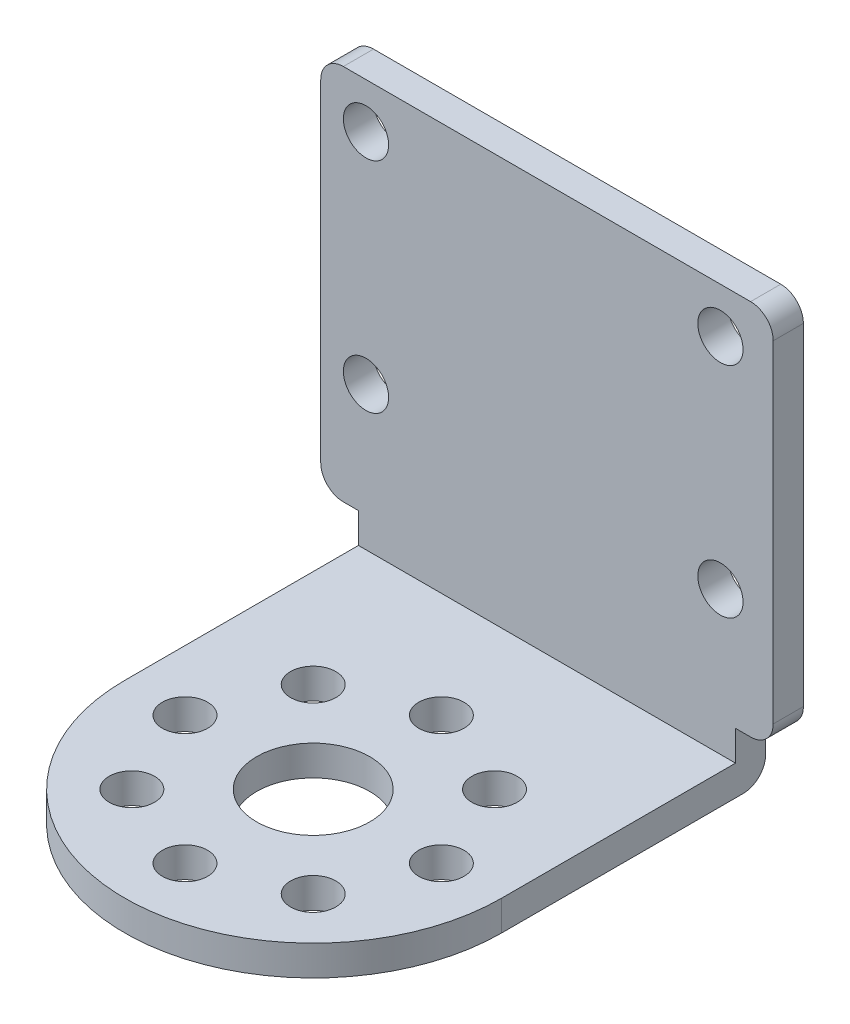
ISO-10303-21;
HEADER;
FILE_DESCRIPTION(('STEP AP214'),'2;1');
FILE_NAME('part.step','',(''),(''),'','','');
FILE_SCHEMA(('AUTOMOTIVE_DESIGN { 1 0 10303 214 1 1 1 1 }'));
ENDSEC;
DATA;
#1=APPLICATION_CONTEXT('core data for automotive mechanical design processes');
#2=APPLICATION_PROTOCOL_DEFINITION('international standard','automotive_design',2000,#1);
#3=PRODUCT_CONTEXT('',#1,'mechanical');
#4=PRODUCT('Part','Part','',(#3));
#5=PRODUCT_RELATED_PRODUCT_CATEGORY('part','',(#4));
#6=PRODUCT_DEFINITION_FORMATION('','',#4);
#7=PRODUCT_DEFINITION_CONTEXT('part definition',#1,'design');
#8=PRODUCT_DEFINITION('design','',#6,#7);
#9=PRODUCT_DEFINITION_SHAPE('','',#8);
#10=(LENGTH_UNIT() NAMED_UNIT(*) SI_UNIT(.MILLI.,.METRE.));
#11=(NAMED_UNIT(*) PLANE_ANGLE_UNIT() SI_UNIT($,.RADIAN.));
#12=(NAMED_UNIT(*) SI_UNIT($,.STERADIAN.) SOLID_ANGLE_UNIT());
#13=UNCERTAINTY_MEASURE_WITH_UNIT(LENGTH_MEASURE(1.E-05),#10,'distance_accuracy_value','');
#14=(GEOMETRIC_REPRESENTATION_CONTEXT(3) GLOBAL_UNCERTAINTY_ASSIGNED_CONTEXT((#13)) GLOBAL_UNIT_ASSIGNED_CONTEXT((#10,
#11,#12)) REPRESENTATION_CONTEXT('',''));
#15=CARTESIAN_POINT('',(0.,0.,0.));
#16=DIRECTION('',(0.,0.,1.));
#17=DIRECTION('',(1.,0.,0.));
#18=AXIS2_PLACEMENT_3D('',#15,#16,#17);
#19=CARTESIAN_POINT('',(0.,14.5,2.));
#20=DIRECTION('',(0.,0.,1.));
#21=DIRECTION('',(1.,0.,0.));
#22=AXIS2_PLACEMENT_3D('',#19,#20,#21);
#23=PLANE('',#22);
#24=CARTESIAN_POINT('',(11.5,11.5,2.));
#25=DIRECTION('',(0.,0.,-1.));
#26=DIRECTION('',(1.,0.,0.));
#27=AXIS2_PLACEMENT_3D('',#24,#25,#26);
#28=CIRCLE('',#27,1.5);
#29=CARTESIAN_POINT('',(10.,11.5,2.));
#30=VERTEX_POINT('',#29);
#31=EDGE_CURVE('E254',#30,#30,#28,.T.);
#32=ORIENTED_EDGE('',*,*,#31,.T.);
#33=EDGE_LOOP('',(#32));
#34=FACE_BOUND('',#33,.T.);
#35=CARTESIAN_POINT('',(11.5,26.,2.));
#36=DIRECTION('',(0.,0.,-1.));
#37=DIRECTION('',(1.,0.,0.));
#38=AXIS2_PLACEMENT_3D('',#35,#36,#37);
#39=CIRCLE('',#38,1.5);
#40=CARTESIAN_POINT('',(10.,26.,2.));
#41=VERTEX_POINT('',#40);
#42=EDGE_CURVE('E214',#41,#41,#39,.T.);
#43=ORIENTED_EDGE('',*,*,#42,.T.);
#44=EDGE_LOOP('',(#43));
#45=FACE_BOUND('',#44,.T.);
#46=CARTESIAN_POINT('',(-12.,11.5,2.));
#47=DIRECTION('',(0.,0.,-1.));
#48=DIRECTION('',(1.,0.,0.));
#49=AXIS2_PLACEMENT_3D('',#46,#47,#48);
#50=CIRCLE('',#49,1.5);
#51=CARTESIAN_POINT('',(-13.5,11.5,2.));
#52=VERTEX_POINT('',#51);
#53=EDGE_CURVE('E213',#52,#52,#50,.T.);
#54=ORIENTED_EDGE('',*,*,#53,.T.);
#55=EDGE_LOOP('',(#54));
#56=FACE_BOUND('',#55,.T.);
#57=CARTESIAN_POINT('',(-12.,26.,2.));
#58=DIRECTION('',(0.,0.,-1.));
#59=DIRECTION('',(1.,0.,0.));
#60=AXIS2_PLACEMENT_3D('',#57,#58,#59);
#61=CIRCLE('',#60,1.5);
#62=CARTESIAN_POINT('',(-13.5,26.,2.));
#63=VERTEX_POINT('',#62);
#64=EDGE_CURVE('E299',#63,#63,#61,.T.);
#65=ORIENTED_EDGE('',*,*,#64,.T.);
#66=EDGE_LOOP('',(#65));
#67=FACE_BOUND('',#66,.T.);
#68=CARTESIAN_POINT('',(13.5,27.5,2.));
#69=DIRECTION('',(0.,0.,-1.));
#70=DIRECTION('',(0.707106781186548,0.707106781186547,0.));
#71=AXIS2_PLACEMENT_3D('',#68,#69,#70);
#72=CIRCLE('',#71,1.5);
#73=CARTESIAN_POINT('',(13.5,29.,2.));
#74=VERTEX_POINT('',#73);
#75=CARTESIAN_POINT('',(15.,27.5,2.));
#76=VERTEX_POINT('',#75);
#77=EDGE_CURVE('E367',#74,#76,#72,.T.);
#78=ORIENTED_EDGE('',*,*,#77,.F.);
#79=DIRECTION('',(-1.,0.,0.));
#80=VECTOR('',#79,1.);
#81=CARTESIAN_POINT('',(-15.,29.,2.));
#82=LINE('',#81,#80);
#83=CARTESIAN_POINT('',(-13.5,29.,2.));
#84=VERTEX_POINT('',#83);
#85=EDGE_CURVE('E443',#74,#84,#82,.T.);
#86=ORIENTED_EDGE('',*,*,#85,.T.);
#87=CARTESIAN_POINT('',(-13.5,27.5,2.));
#88=DIRECTION('',(0.,0.,-1.));
#89=DIRECTION('',(-0.707106781186546,0.707106781186549,0.));
#90=AXIS2_PLACEMENT_3D('',#87,#88,#89);
#91=CIRCLE('',#90,1.5);
#92=CARTESIAN_POINT('',(-15.,27.5,2.));
#93=VERTEX_POINT('',#92);
#94=EDGE_CURVE('E339',#93,#84,#91,.T.);
#95=ORIENTED_EDGE('',*,*,#94,.F.);
#96=DIRECTION('',(0.,-1.,0.));
#97=VECTOR('',#96,1.);
#98=CARTESIAN_POINT('',(-15.,4.,2.));
#99=LINE('',#98,#97);
#100=CARTESIAN_POINT('',(-15.,5.5,2.));
#101=VERTEX_POINT('',#100);
#102=EDGE_CURVE('E26',#93,#101,#99,.T.);
#103=ORIENTED_EDGE('',*,*,#102,.T.);
#104=CARTESIAN_POINT('',(-13.5,5.5,2.));
#105=DIRECTION('',(0.,0.,-1.));
#106=DIRECTION('',(-0.707106781186547,-0.707106781186548,0.));
#107=AXIS2_PLACEMENT_3D('',#104,#105,#106);
#108=CIRCLE('',#107,1.5);
#109=CARTESIAN_POINT('',(-13.5,4.,2.));
#110=VERTEX_POINT('',#109);
#111=EDGE_CURVE('E183',#110,#101,#108,.T.);
#112=ORIENTED_EDGE('',*,*,#111,.F.);
#113=DIRECTION('',(1.,0.,0.));
#114=VECTOR('',#113,1.);
#115=CARTESIAN_POINT('',(-15.,4.,2.));
#116=LINE('',#115,#114);
#117=CARTESIAN_POINT('',(-12.5,4.,2.));
#118=VERTEX_POINT('',#117);
#119=EDGE_CURVE('E344',#110,#118,#116,.T.);
#120=ORIENTED_EDGE('',*,*,#119,.T.);
#121=DIRECTION('',(0.,-1.,0.));
#122=VECTOR('',#121,1.);
#123=CARTESIAN_POINT('',(-12.5,4.,2.));
#124=LINE('',#123,#122);
#125=CARTESIAN_POINT('',(-12.5,2.,2.));
#126=VERTEX_POINT('',#125);
#127=EDGE_CURVE('E338',#118,#126,#124,.T.);
#128=ORIENTED_EDGE('',*,*,#127,.T.);
#129=DIRECTION('',(1.,0.,0.));
#130=VECTOR('',#129,1.);
#131=CARTESIAN_POINT('',(6.25,2.,2.));
#132=LINE('',#131,#130);
#133=CARTESIAN_POINT('',(12.5,2.,2.));
#134=VERTEX_POINT('',#133);
#135=EDGE_CURVE('E308',#126,#134,#132,.T.);
#136=ORIENTED_EDGE('',*,*,#135,.T.);
#137=DIRECTION('',(0.,1.,0.));
#138=VECTOR('',#137,1.);
#139=CARTESIAN_POINT('',(12.5,4.,2.));
#140=LINE('',#139,#138);
#141=CARTESIAN_POINT('',(12.5,4.,2.));
#142=VERTEX_POINT('',#141);
#143=EDGE_CURVE('E193',#134,#142,#140,.T.);
#144=ORIENTED_EDGE('',*,*,#143,.T.);
#145=DIRECTION('',(1.,0.,0.));
#146=VECTOR('',#145,1.);
#147=CARTESIAN_POINT('',(15.,4.,2.));
#148=LINE('',#147,#146);
#149=CARTESIAN_POINT('',(13.5,4.,2.));
#150=VERTEX_POINT('',#149);
#151=EDGE_CURVE('E11',#142,#150,#148,.T.);
#152=ORIENTED_EDGE('',*,*,#151,.T.);
#153=CARTESIAN_POINT('',(13.5,5.5,2.));
#154=DIRECTION('',(0.,0.,-1.));
#155=DIRECTION('',(0.707106781186547,-0.707106781186548,0.));
#156=AXIS2_PLACEMENT_3D('',#153,#154,#155);
#157=CIRCLE('',#156,1.5);
#158=CARTESIAN_POINT('',(15.,5.5,2.));
#159=VERTEX_POINT('',#158);
#160=EDGE_CURVE('E382',#159,#150,#157,.T.);
#161=ORIENTED_EDGE('',*,*,#160,.F.);
#162=DIRECTION('',(0.,1.,0.));
#163=VECTOR('',#162,1.);
#164=CARTESIAN_POINT('',(15.,29.,2.));
#165=LINE('',#164,#163);
#166=EDGE_CURVE('E295',#159,#76,#165,.T.);
#167=ORIENTED_EDGE('',*,*,#166,.T.);
#168=EDGE_LOOP('',(#78,#86,#95,#103,#112,#120,#128,#136,#144,#152,#161,#167));
#169=FACE_BOUND('',#168,.T.);
#170=ADVANCED_FACE('F16',(#34,#45,#56,#67,#169),#23,.T.);
#171=CARTESIAN_POINT('',(12.5,4.,0.));
#172=DIRECTION('',(0.,-1.,0.));
#173=DIRECTION('',(0.,0.,-1.));
#174=AXIS2_PLACEMENT_3D('',#171,#172,#173);
#175=PLANE('',#174);
#176=DIRECTION('',(0.,0.,-1.));
#177=VECTOR('',#176,1.);
#178=CARTESIAN_POINT('',(13.5,4.,0.));
#179=LINE('',#178,#177);
#180=CARTESIAN_POINT('',(13.5,4.,0.));
#181=VERTEX_POINT('',#180);
#182=EDGE_CURVE('E378',#150,#181,#179,.T.);
#183=ORIENTED_EDGE('',*,*,#182,.F.);
#184=ORIENTED_EDGE('',*,*,#151,.F.);
#185=DIRECTION('',(0.,0.,1.));
#186=VECTOR('',#185,1.);
#187=CARTESIAN_POINT('',(12.5,4.,0.));
#188=LINE('',#187,#186);
#189=CARTESIAN_POINT('',(12.5,4.,0.));
#190=VERTEX_POINT('',#189);
#191=EDGE_CURVE('E318',#190,#142,#188,.T.);
#192=ORIENTED_EDGE('',*,*,#191,.F.);
#193=DIRECTION('',(-1.,0.,0.));
#194=VECTOR('',#193,1.);
#195=CARTESIAN_POINT('',(15.,4.,0.));
#196=LINE('',#195,#194);
#197=EDGE_CURVE('E242',#181,#190,#196,.T.);
#198=ORIENTED_EDGE('',*,*,#197,.F.);
#199=EDGE_LOOP('',(#183,#184,#192,#198));
#200=FACE_BOUND('',#199,.T.);
#201=ADVANCED_FACE('F706',(#200),#175,.T.);
#202=CARTESIAN_POINT('',(-15.,29.,0.));
#203=DIRECTION('',(-1.,0.,0.));
#204=DIRECTION('',(0.,0.,1.));
#205=AXIS2_PLACEMENT_3D('',#202,#203,#204);
#206=PLANE('',#205);
#207=DIRECTION('',(0.,0.,-1.));
#208=VECTOR('',#207,1.);
#209=CARTESIAN_POINT('',(-15.,5.5,0.));
#210=LINE('',#209,#208);
#211=CARTESIAN_POINT('',(-15.,5.5,0.));
#212=VERTEX_POINT('',#211);
#213=EDGE_CURVE('E258',#101,#212,#210,.T.);
#214=ORIENTED_EDGE('',*,*,#213,.F.);
#215=ORIENTED_EDGE('',*,*,#102,.F.);
#216=DIRECTION('',(0.,0.,1.));
#217=VECTOR('',#216,1.);
#218=CARTESIAN_POINT('',(-15.,27.5,0.));
#219=LINE('',#218,#217);
#220=CARTESIAN_POINT('',(-15.,27.5,0.));
#221=VERTEX_POINT('',#220);
#222=EDGE_CURVE('E450',#221,#93,#219,.T.);
#223=ORIENTED_EDGE('',*,*,#222,.F.);
#224=DIRECTION('',(0.,1.,0.));
#225=VECTOR('',#224,1.);
#226=CARTESIAN_POINT('',(-15.,4.,0.));
#227=LINE('',#226,#225);
#228=EDGE_CURVE('E304',#212,#221,#227,.T.);
#229=ORIENTED_EDGE('',*,*,#228,.F.);
#230=EDGE_LOOP('',(#214,#215,#223,#229));
#231=FACE_BOUND('',#230,.T.);
#232=ADVANCED_FACE('F526',(#231),#206,.T.);
#233=CARTESIAN_POINT('',(-12.,26.,0.));
#234=DIRECTION('',(0.,0.,1.));
#235=DIRECTION('',(1.,0.,0.));
#236=AXIS2_PLACEMENT_3D('',#233,#234,#235);
#237=CYLINDRICAL_SURFACE('',#236,1.5);
#238=ORIENTED_EDGE('',*,*,#64,.F.);
#239=DIRECTION('',(0.,0.,-1.));
#240=VECTOR('',#239,1.);
#241=CARTESIAN_POINT('',(-13.5,26.,0.));
#242=LINE('',#241,#240);
#243=CARTESIAN_POINT('',(-13.5,26.,0.));
#244=VERTEX_POINT('',#243);
#245=EDGE_CURVE('E39',#63,#244,#242,.T.);
#246=ORIENTED_EDGE('',*,*,#245,.T.);
#247=CARTESIAN_POINT('',(-12.,26.,0.));
#248=DIRECTION('',(0.,0.,-1.));
#249=DIRECTION('',(1.,0.,0.));
#250=AXIS2_PLACEMENT_3D('',#247,#248,#249);
#251=CIRCLE('',#250,1.5);
#252=EDGE_CURVE('E208',#244,#244,#251,.T.);
#253=ORIENTED_EDGE('',*,*,#252,.T.);
#254=ORIENTED_EDGE('',*,*,#245,.F.);
#255=EDGE_LOOP('',(#238,#246,#253,#254));
#256=FACE_BOUND('',#255,.T.);
#257=ADVANCED_FACE('F649',(#256),#237,.F.);
#258=CARTESIAN_POINT('',(-12.,11.5,0.));
#259=DIRECTION('',(0.,0.,1.));
#260=DIRECTION('',(1.,0.,0.));
#261=AXIS2_PLACEMENT_3D('',#258,#259,#260);
#262=CYLINDRICAL_SURFACE('',#261,1.5);
#263=ORIENTED_EDGE('',*,*,#53,.F.);
#264=DIRECTION('',(0.,0.,-1.));
#265=VECTOR('',#264,1.);
#266=CARTESIAN_POINT('',(-13.5,11.5,0.));
#267=LINE('',#266,#265);
#268=CARTESIAN_POINT('',(-13.5,11.5,0.));
#269=VERTEX_POINT('',#268);
#270=EDGE_CURVE('E296',#52,#269,#267,.T.);
#271=ORIENTED_EDGE('',*,*,#270,.T.);
#272=CARTESIAN_POINT('',(-12.,11.5,0.));
#273=DIRECTION('',(0.,0.,-1.));
#274=DIRECTION('',(1.,0.,0.));
#275=AXIS2_PLACEMENT_3D('',#272,#273,#274);
#276=CIRCLE('',#275,1.5);
#277=EDGE_CURVE('E204',#269,#269,#276,.T.);
#278=ORIENTED_EDGE('',*,*,#277,.T.);
#279=ORIENTED_EDGE('',*,*,#270,.F.);
#280=EDGE_LOOP('',(#263,#271,#278,#279));
#281=FACE_BOUND('',#280,.T.);
#282=ADVANCED_FACE('F654',(#281),#262,.F.);
#283=CARTESIAN_POINT('',(11.5,26.,0.));
#284=DIRECTION('',(0.,0.,1.));
#285=DIRECTION('',(1.,0.,0.));
#286=AXIS2_PLACEMENT_3D('',#283,#284,#285);
#287=CYLINDRICAL_SURFACE('',#286,1.5);
#288=ORIENTED_EDGE('',*,*,#42,.F.);
#289=DIRECTION('',(0.,0.,-1.));
#290=VECTOR('',#289,1.);
#291=CARTESIAN_POINT('',(10.,26.,0.));
#292=LINE('',#291,#290);
#293=CARTESIAN_POINT('',(10.,26.,0.));
#294=VERTEX_POINT('',#293);
#295=EDGE_CURVE('E210',#41,#294,#292,.T.);
#296=ORIENTED_EDGE('',*,*,#295,.T.);
#297=CARTESIAN_POINT('',(11.5,26.,0.));
#298=DIRECTION('',(0.,0.,-1.));
#299=DIRECTION('',(1.,0.,0.));
#300=AXIS2_PLACEMENT_3D('',#297,#298,#299);
#301=CIRCLE('',#300,1.5);
#302=EDGE_CURVE('E209',#294,#294,#301,.T.);
#303=ORIENTED_EDGE('',*,*,#302,.T.);
#304=ORIENTED_EDGE('',*,*,#295,.F.);
#305=EDGE_LOOP('',(#288,#296,#303,#304));
#306=FACE_BOUND('',#305,.T.);
#307=ADVANCED_FACE('F719',(#306),#287,.F.);
#308=CARTESIAN_POINT('',(11.5,11.5,0.));
#309=DIRECTION('',(0.,0.,1.));
#310=DIRECTION('',(1.,0.,0.));
#311=AXIS2_PLACEMENT_3D('',#308,#309,#310);
#312=CYLINDRICAL_SURFACE('',#311,1.5);
#313=ORIENTED_EDGE('',*,*,#31,.F.);
#314=DIRECTION('',(0.,0.,-1.));
#315=VECTOR('',#314,1.);
#316=CARTESIAN_POINT('',(10.,11.5,0.));
#317=LINE('',#316,#315);
#318=CARTESIAN_POINT('',(10.,11.5,0.));
#319=VERTEX_POINT('',#318);
#320=EDGE_CURVE('E233',#30,#319,#317,.T.);
#321=ORIENTED_EDGE('',*,*,#320,.T.);
#322=CARTESIAN_POINT('',(11.5,11.5,0.));
#323=DIRECTION('',(0.,0.,-1.));
#324=DIRECTION('',(1.,0.,0.));
#325=AXIS2_PLACEMENT_3D('',#322,#323,#324);
#326=CIRCLE('',#325,1.5);
#327=EDGE_CURVE('E218',#319,#319,#326,.T.);
#328=ORIENTED_EDGE('',*,*,#327,.T.);
#329=ORIENTED_EDGE('',*,*,#320,.F.);
#330=EDGE_LOOP('',(#313,#321,#328,#329));
#331=FACE_BOUND('',#330,.T.);
#332=ADVANCED_FACE('F425',(#331),#312,.F.);
#333=CARTESIAN_POINT('',(12.5,2.,2.));
#334=DIRECTION('',(0.,1.,0.));
#335=DIRECTION('',(1.,0.,0.));
#336=AXIS2_PLACEMENT_3D('',#333,#334,#335);
#337=PLANE('',#336);
#338=CARTESIAN_POINT('',(6.01040791404017,2.,23.5104079140402));
#339=DIRECTION('',(0.,-1.,0.));
#340=DIRECTION('',(1.,0.,0.));
#341=AXIS2_PLACEMENT_3D('',#338,#339,#340);
#342=CIRCLE('',#341,1.5);
#343=CARTESIAN_POINT('',(4.51040791404017,2.,23.5104079140402));
#344=VERTEX_POINT('',#343);
#345=EDGE_CURVE('E224',#344,#344,#342,.T.);
#346=ORIENTED_EDGE('',*,*,#345,.T.);
#347=EDGE_LOOP('',(#346));
#348=FACE_BOUND('',#347,.T.);
#349=CARTESIAN_POINT('',(-6.01040791404017,2.,11.4895920859598));
#350=DIRECTION('',(0.,-1.,0.));
#351=DIRECTION('',(1.,0.,0.));
#352=AXIS2_PLACEMENT_3D('',#349,#350,#351);
#353=CIRCLE('',#352,1.5);
#354=CARTESIAN_POINT('',(-7.51040791404017,2.,11.4895920859598));
#355=VERTEX_POINT('',#354);
#356=EDGE_CURVE('E348',#355,#355,#353,.T.);
#357=ORIENTED_EDGE('',*,*,#356,.T.);
#358=EDGE_LOOP('',(#357));
#359=FACE_BOUND('',#358,.T.);
#360=CARTESIAN_POINT('',(0.,2.,26.0000003874302));
#361=DIRECTION('',(0.,-1.,0.));
#362=DIRECTION('',(1.,0.,0.));
#363=AXIS2_PLACEMENT_3D('',#360,#361,#362);
#364=CIRCLE('',#363,1.5);
#365=CARTESIAN_POINT('',(-1.5,2.,26.0000003874302));
#366=VERTEX_POINT('',#365);
#367=EDGE_CURVE('E219',#366,#366,#364,.T.);
#368=ORIENTED_EDGE('',*,*,#367,.T.);
#369=EDGE_LOOP('',(#368));
#370=FACE_BOUND('',#369,.T.);
#371=CARTESIAN_POINT('',(0.,2.,17.5));
#372=DIRECTION('',(0.,-1.,0.));
#373=DIRECTION('',(1.,0.,0.));
#374=AXIS2_PLACEMENT_3D('',#371,#372,#373);
#375=CIRCLE('',#374,3.75);
#376=CARTESIAN_POINT('',(-3.75,2.,17.5));
#377=VERTEX_POINT('',#376);
#378=EDGE_CURVE('E261',#377,#377,#375,.T.);
#379=ORIENTED_EDGE('',*,*,#378,.T.);
#380=EDGE_LOOP('',(#379));
#381=FACE_BOUND('',#380,.T.);
#382=CARTESIAN_POINT('',(8.50000038743019,2.,17.5));
#383=DIRECTION('',(0.,-1.,0.));
#384=DIRECTION('',(1.,0.,0.));
#385=AXIS2_PLACEMENT_3D('',#382,#383,#384);
#386=CIRCLE('',#385,1.5);
#387=CARTESIAN_POINT('',(7.00000038743019,2.,17.5));
#388=VERTEX_POINT('',#387);
#389=EDGE_CURVE('E268',#388,#388,#386,.T.);
#390=ORIENTED_EDGE('',*,*,#389,.T.);
#391=EDGE_LOOP('',(#390));
#392=FACE_BOUND('',#391,.T.);
#393=CARTESIAN_POINT('',(0.,2.,8.99999961256981));
#394=DIRECTION('',(0.,-1.,0.));
#395=DIRECTION('',(1.,0.,0.));
#396=AXIS2_PLACEMENT_3D('',#393,#394,#395);
#397=CIRCLE('',#396,1.5);
#398=CARTESIAN_POINT('',(-1.5,2.,8.99999961256981));
#399=VERTEX_POINT('',#398);
#400=EDGE_CURVE('E199',#399,#399,#397,.T.);
#401=ORIENTED_EDGE('',*,*,#400,.T.);
#402=EDGE_LOOP('',(#401));
#403=FACE_BOUND('',#402,.T.);
#404=CARTESIAN_POINT('',(-6.01040791404017,2.,23.5104079140402));
#405=DIRECTION('',(0.,-1.,0.));
#406=DIRECTION('',(1.,0.,0.));
#407=AXIS2_PLACEMENT_3D('',#404,#405,#406);
#408=CIRCLE('',#407,1.5);
#409=CARTESIAN_POINT('',(-7.51040791404017,2.,23.5104079140402));
#410=VERTEX_POINT('',#409);
#411=EDGE_CURVE('E282',#410,#410,#408,.T.);
#412=ORIENTED_EDGE('',*,*,#411,.T.);
#413=EDGE_LOOP('',(#412));
#414=FACE_BOUND('',#413,.T.);
#415=CARTESIAN_POINT('',(-8.50000038743019,2.,17.5));
#416=DIRECTION('',(0.,-1.,0.));
#417=DIRECTION('',(1.,0.,0.));
#418=AXIS2_PLACEMENT_3D('',#415,#416,#417);
#419=CIRCLE('',#418,1.5);
#420=CARTESIAN_POINT('',(-10.0000003874302,2.,17.5));
#421=VERTEX_POINT('',#420);
#422=EDGE_CURVE('E331',#421,#421,#419,.T.);
#423=ORIENTED_EDGE('',*,*,#422,.T.);
#424=EDGE_LOOP('',(#423));
#425=FACE_BOUND('',#424,.T.);
#426=CARTESIAN_POINT('',(6.01040791404017,2.,11.4895920859598));
#427=DIRECTION('',(0.,-1.,0.));
#428=DIRECTION('',(1.,0.,0.));
#429=AXIS2_PLACEMENT_3D('',#426,#427,#428);
#430=CIRCLE('',#429,1.5);
#431=CARTESIAN_POINT('',(4.51040791404017,2.,11.4895920859598));
#432=VERTEX_POINT('',#431);
#433=EDGE_CURVE('E262',#432,#432,#430,.T.);
#434=ORIENTED_EDGE('',*,*,#433,.T.);
#435=EDGE_LOOP('',(#434));
#436=FACE_BOUND('',#435,.T.);
#437=CARTESIAN_POINT('',(0.,2.,17.5));
#438=DIRECTION('',(0.,1.,0.));
#439=DIRECTION('',(1.,0.,0.));
#440=AXIS2_PLACEMENT_3D('',#437,#438,#439);
#441=CIRCLE('',#440,12.5);
#442=CARTESIAN_POINT('',(-12.5,2.,17.5));
#443=VERTEX_POINT('',#442);
#444=CARTESIAN_POINT('',(12.5,2.,17.5));
#445=VERTEX_POINT('',#444);
#446=EDGE_CURVE('E154',#443,#445,#441,.T.);
#447=ORIENTED_EDGE('',*,*,#446,.T.);
#448=DIRECTION('',(0.,0.,1.));
#449=VECTOR('',#448,1.);
#450=CARTESIAN_POINT('',(12.5,2.,2.));
#451=LINE('',#450,#449);
#452=EDGE_CURVE('E187',#134,#445,#451,.T.);
#453=ORIENTED_EDGE('',*,*,#452,.F.);
#454=ORIENTED_EDGE('',*,*,#135,.F.);
#455=DIRECTION('',(0.,0.,1.));
#456=VECTOR('',#455,1.);
#457=CARTESIAN_POINT('',(-12.5,2.,2.));
#458=LINE('',#457,#456);
#459=EDGE_CURVE('E335',#126,#443,#458,.T.);
#460=ORIENTED_EDGE('',*,*,#459,.T.);
#461=EDGE_LOOP('',(#447,#453,#454,#460));
#462=FACE_BOUND('',#461,.T.);
#463=ADVANCED_FACE('F422',(#348,#359,#370,#381,#392,#403,#414,#425,#436,#462),#337,.T.);
#464=CARTESIAN_POINT('',(-12.5,0.,0.));
#465=DIRECTION('',(0.,-1.,0.));
#466=DIRECTION('',(0.,0.,-1.));
#467=AXIS2_PLACEMENT_3D('',#464,#465,#466);
#468=PLANE('',#467);
#469=CARTESIAN_POINT('',(6.01040791404017,0.,11.4895920859598));
#470=DIRECTION('',(0.,1.,0.));
#471=DIRECTION('',(1.,0.,0.));
#472=AXIS2_PLACEMENT_3D('',#469,#470,#471);
#473=CIRCLE('',#472,1.5);
#474=CARTESIAN_POINT('',(4.51040791404017,0.,11.4895920859598));
#475=VERTEX_POINT('',#474);
#476=EDGE_CURVE('E438',#475,#475,#473,.T.);
#477=ORIENTED_EDGE('',*,*,#476,.T.);
#478=EDGE_LOOP('',(#477));
#479=FACE_BOUND('',#478,.T.);
#480=CARTESIAN_POINT('',(-8.50000038743019,0.,17.5));
#481=DIRECTION('',(0.,1.,0.));
#482=DIRECTION('',(1.,0.,0.));
#483=AXIS2_PLACEMENT_3D('',#480,#481,#482);
#484=CIRCLE('',#483,1.5);
#485=CARTESIAN_POINT('',(-10.0000003874302,0.,17.5));
#486=VERTEX_POINT('',#485);
#487=EDGE_CURVE('E266',#486,#486,#484,.T.);
#488=ORIENTED_EDGE('',*,*,#487,.T.);
#489=EDGE_LOOP('',(#488));
#490=FACE_BOUND('',#489,.T.);
#491=CARTESIAN_POINT('',(-6.01040791404017,0.,23.5104079140402));
#492=DIRECTION('',(0.,1.,0.));
#493=DIRECTION('',(1.,0.,0.));
#494=AXIS2_PLACEMENT_3D('',#491,#492,#493);
#495=CIRCLE('',#494,1.5);
#496=CARTESIAN_POINT('',(-7.51040791404017,0.,23.5104079140402));
#497=VERTEX_POINT('',#496);
#498=EDGE_CURVE('E283',#497,#497,#495,.T.);
#499=ORIENTED_EDGE('',*,*,#498,.T.);
#500=EDGE_LOOP('',(#499));
#501=FACE_BOUND('',#500,.T.);
#502=CARTESIAN_POINT('',(0.,0.,8.99999961256981));
#503=DIRECTION('',(0.,1.,0.));
#504=DIRECTION('',(1.,0.,0.));
#505=AXIS2_PLACEMENT_3D('',#502,#503,#504);
#506=CIRCLE('',#505,1.5);
#507=CARTESIAN_POINT('',(-1.5,0.,8.99999961256981));
#508=VERTEX_POINT('',#507);
#509=EDGE_CURVE('E366',#508,#508,#506,.T.);
#510=ORIENTED_EDGE('',*,*,#509,.T.);
#511=EDGE_LOOP('',(#510));
#512=FACE_BOUND('',#511,.T.);
#513=CARTESIAN_POINT('',(8.50000038743019,0.,17.5));
#514=DIRECTION('',(0.,1.,0.));
#515=DIRECTION('',(1.,0.,0.));
#516=AXIS2_PLACEMENT_3D('',#513,#514,#515);
#517=CIRCLE('',#516,1.5);
#518=CARTESIAN_POINT('',(7.00000038743019,0.,17.5));
#519=VERTEX_POINT('',#518);
#520=EDGE_CURVE('E202',#519,#519,#517,.T.);
#521=ORIENTED_EDGE('',*,*,#520,.T.);
#522=EDGE_LOOP('',(#521));
#523=FACE_BOUND('',#522,.T.);
#524=CARTESIAN_POINT('',(0.,0.,17.5));
#525=DIRECTION('',(0.,1.,0.));
#526=DIRECTION('',(1.,0.,0.));
#527=AXIS2_PLACEMENT_3D('',#524,#525,#526);
#528=CIRCLE('',#527,3.75);
#529=CARTESIAN_POINT('',(-3.75,0.,17.5));
#530=VERTEX_POINT('',#529);
#531=EDGE_CURVE('E271',#530,#530,#528,.T.);
#532=ORIENTED_EDGE('',*,*,#531,.T.);
#533=EDGE_LOOP('',(#532));
#534=FACE_BOUND('',#533,.T.);
#535=CARTESIAN_POINT('',(0.,0.,26.0000003874302));
#536=DIRECTION('',(0.,1.,0.));
#537=DIRECTION('',(1.,0.,0.));
#538=AXIS2_PLACEMENT_3D('',#535,#536,#537);
#539=CIRCLE('',#538,1.5);
#540=CARTESIAN_POINT('',(-1.5,0.,26.0000003874302));
#541=VERTEX_POINT('',#540);
#542=EDGE_CURVE('E172',#541,#541,#539,.T.);
#543=ORIENTED_EDGE('',*,*,#542,.T.);
#544=EDGE_LOOP('',(#543));
#545=FACE_BOUND('',#544,.T.);
#546=CARTESIAN_POINT('',(-6.01040791404017,0.,11.4895920859598));
#547=DIRECTION('',(0.,1.,0.));
#548=DIRECTION('',(1.,0.,0.));
#549=AXIS2_PLACEMENT_3D('',#546,#547,#548);
#550=CIRCLE('',#549,1.5);
#551=CARTESIAN_POINT('',(-7.51040791404017,0.,11.4895920859598));
#552=VERTEX_POINT('',#551);
#553=EDGE_CURVE('E222',#552,#552,#550,.T.);
#554=ORIENTED_EDGE('',*,*,#553,.T.);
#555=EDGE_LOOP('',(#554));
#556=FACE_BOUND('',#555,.T.);
#557=CARTESIAN_POINT('',(6.01040791404017,0.,23.5104079140402));
#558=DIRECTION('',(0.,1.,0.));
#559=DIRECTION('',(1.,0.,0.));
#560=AXIS2_PLACEMENT_3D('',#557,#558,#559);
#561=CIRCLE('',#560,1.5);
#562=CARTESIAN_POINT('',(4.51040791404017,0.,23.5104079140402));
#563=VERTEX_POINT('',#562);
#564=EDGE_CURVE('E250',#563,#563,#561,.T.);
#565=ORIENTED_EDGE('',*,*,#564,.T.);
#566=EDGE_LOOP('',(#565));
#567=FACE_BOUND('',#566,.T.);
#568=DIRECTION('',(-1.,0.,0.));
#569=VECTOR('',#568,1.);
#570=CARTESIAN_POINT('',(-6.25,0.,1.5));
#571=LINE('',#570,#569);
#572=CARTESIAN_POINT('',(12.5,0.,1.5));
#573=VERTEX_POINT('',#572);
#574=CARTESIAN_POINT('',(-12.5,0.,1.5));
#575=VERTEX_POINT('',#574);
#576=EDGE_CURVE('E179',#573,#575,#571,.T.);
#577=ORIENTED_EDGE('',*,*,#576,.F.);
#578=DIRECTION('',(0.,0.,1.));
#579=VECTOR('',#578,1.);
#580=CARTESIAN_POINT('',(12.5,0.,0.));
#581=LINE('',#580,#579);
#582=CARTESIAN_POINT('',(12.5,0.,17.5));
#583=VERTEX_POINT('',#582);
#584=EDGE_CURVE('E176',#573,#583,#581,.T.);
#585=ORIENTED_EDGE('',*,*,#584,.T.);
#586=CARTESIAN_POINT('',(0.,0.,17.5));
#587=DIRECTION('',(0.,-1.,0.));
#588=DIRECTION('',(1.,0.,0.));
#589=AXIS2_PLACEMENT_3D('',#586,#587,#588);
#590=CIRCLE('',#589,12.5);
#591=CARTESIAN_POINT('',(-12.5,0.,17.5));
#592=VERTEX_POINT('',#591);
#593=EDGE_CURVE('E162',#583,#592,#590,.T.);
#594=ORIENTED_EDGE('',*,*,#593,.T.);
#595=DIRECTION('',(0.,0.,1.));
#596=VECTOR('',#595,1.);
#597=CARTESIAN_POINT('',(-12.5,0.,0.));
#598=LINE('',#597,#596);
#599=EDGE_CURVE('E227',#575,#592,#598,.T.);
#600=ORIENTED_EDGE('',*,*,#599,.F.);
#601=EDGE_LOOP('',(#577,#585,#594,#600));
#602=FACE_BOUND('',#601,.T.);
#603=ADVANCED_FACE('F177',(#479,#490,#501,#512,#523,#534,#545,#556,#567,#602),#468,.T.);
#604=CARTESIAN_POINT('',(-12.5,4.,0.));
#605=DIRECTION('',(-1.,0.,0.));
#606=DIRECTION('',(0.,0.,1.));
#607=AXIS2_PLACEMENT_3D('',#604,#605,#606);
#608=PLANE('',#607);
#609=CARTESIAN_POINT('',(-12.5,1.5,1.5));
#610=DIRECTION('',(1.,0.,0.));
#611=DIRECTION('',(0.,-0.707106781186548,-0.707106781186548));
#612=AXIS2_PLACEMENT_3D('',#609,#610,#611);
#613=CIRCLE('',#612,1.5);
#614=CARTESIAN_POINT('',(-12.5,1.5,0.));
#615=VERTEX_POINT('',#614);
#616=EDGE_CURVE('E315',#575,#615,#613,.T.);
#617=ORIENTED_EDGE('',*,*,#616,.F.);
#618=ORIENTED_EDGE('',*,*,#599,.T.);
#619=DIRECTION('',(0.,-1.,0.));
#620=VECTOR('',#619,1.);
#621=CARTESIAN_POINT('',(-12.5,0.,17.5));
#622=LINE('',#621,#620);
#623=EDGE_CURVE('E169',#443,#592,#622,.T.);
#624=ORIENTED_EDGE('',*,*,#623,.F.);
#625=ORIENTED_EDGE('',*,*,#459,.F.);
#626=ORIENTED_EDGE('',*,*,#127,.F.);
#627=DIRECTION('',(0.,0.,1.));
#628=VECTOR('',#627,1.);
#629=CARTESIAN_POINT('',(-12.5,4.,0.));
#630=LINE('',#629,#628);
#631=CARTESIAN_POINT('',(-12.5,4.,0.));
#632=VERTEX_POINT('',#631);
#633=EDGE_CURVE('E277',#632,#118,#630,.T.);
#634=ORIENTED_EDGE('',*,*,#633,.F.);
#635=DIRECTION('',(0.,-1.,0.));
#636=VECTOR('',#635,1.);
#637=CARTESIAN_POINT('',(-12.5,4.,0.));
#638=LINE('',#637,#636);
#639=EDGE_CURVE('E371',#632,#615,#638,.T.);
#640=ORIENTED_EDGE('',*,*,#639,.T.);
#641=EDGE_LOOP('',(#617,#618,#624,#625,#626,#634,#640));
#642=FACE_BOUND('',#641,.T.);
#643=ADVANCED_FACE('F732',(#642),#608,.T.);
#644=CARTESIAN_POINT('',(6.01040791404017,0.,23.5104079140402));
#645=DIRECTION('',(0.,1.,0.));
#646=DIRECTION('',(1.,0.,0.));
#647=AXIS2_PLACEMENT_3D('',#644,#645,#646);
#648=CYLINDRICAL_SURFACE('',#647,1.5);
#649=ORIENTED_EDGE('',*,*,#564,.F.);
#650=DIRECTION('',(0.,1.,0.));
#651=VECTOR('',#650,1.);
#652=CARTESIAN_POINT('',(4.51040791404017,0.,23.5104079140402));
#653=LINE('',#652,#651);
#654=EDGE_CURVE('E228',#563,#344,#653,.T.);
#655=ORIENTED_EDGE('',*,*,#654,.T.);
#656=ORIENTED_EDGE('',*,*,#345,.F.);
#657=ORIENTED_EDGE('',*,*,#654,.F.);
#658=EDGE_LOOP('',(#649,#655,#656,#657));
#659=FACE_BOUND('',#658,.T.);
#660=ADVANCED_FACE('F18',(#659),#648,.F.);
#661=CARTESIAN_POINT('',(-6.01040791404017,0.,11.4895920859598));
#662=DIRECTION('',(0.,1.,0.));
#663=DIRECTION('',(1.,0.,0.));
#664=AXIS2_PLACEMENT_3D('',#661,#662,#663);
#665=CYLINDRICAL_SURFACE('',#664,1.5);
#666=ORIENTED_EDGE('',*,*,#553,.F.);
#667=DIRECTION('',(0.,1.,0.));
#668=VECTOR('',#667,1.);
#669=CARTESIAN_POINT('',(-7.51040791404017,0.,11.4895920859598));
#670=LINE('',#669,#668);
#671=EDGE_CURVE('E345',#552,#355,#670,.T.);
#672=ORIENTED_EDGE('',*,*,#671,.T.);
#673=ORIENTED_EDGE('',*,*,#356,.F.);
#674=ORIENTED_EDGE('',*,*,#671,.F.);
#675=EDGE_LOOP('',(#666,#672,#673,#674));
#676=FACE_BOUND('',#675,.T.);
#677=ADVANCED_FACE('F837',(#676),#665,.F.);
#678=CARTESIAN_POINT('',(0.,0.,26.0000003874302));
#679=DIRECTION('',(0.,1.,0.));
#680=DIRECTION('',(1.,0.,0.));
#681=AXIS2_PLACEMENT_3D('',#678,#679,#680);
#682=CYLINDRICAL_SURFACE('',#681,1.5);
#683=ORIENTED_EDGE('',*,*,#542,.F.);
#684=DIRECTION('',(0.,1.,0.));
#685=VECTOR('',#684,1.);
#686=CARTESIAN_POINT('',(-1.5,0.,26.0000003874302));
#687=LINE('',#686,#685);
#688=EDGE_CURVE('E223',#541,#366,#687,.T.);
#689=ORIENTED_EDGE('',*,*,#688,.T.);
#690=ORIENTED_EDGE('',*,*,#367,.F.);
#691=ORIENTED_EDGE('',*,*,#688,.F.);
#692=EDGE_LOOP('',(#683,#689,#690,#691));
#693=FACE_BOUND('',#692,.T.);
#694=ADVANCED_FACE('F665',(#693),#682,.F.);
#695=CARTESIAN_POINT('',(0.,0.,17.5));
#696=DIRECTION('',(0.,1.,0.));
#697=DIRECTION('',(1.,0.,0.));
#698=AXIS2_PLACEMENT_3D('',#695,#696,#697);
#699=CYLINDRICAL_SURFACE('',#698,12.5);
#700=ORIENTED_EDGE('',*,*,#446,.F.);
#701=ORIENTED_EDGE('',*,*,#623,.T.);
#702=ORIENTED_EDGE('',*,*,#593,.F.);
#703=DIRECTION('',(0.,-1.,0.));
#704=VECTOR('',#703,1.);
#705=CARTESIAN_POINT('',(12.5,0.,17.5));
#706=LINE('',#705,#704);
#707=EDGE_CURVE('E166',#445,#583,#706,.T.);
#708=ORIENTED_EDGE('',*,*,#707,.F.);
#709=EDGE_LOOP('',(#700,#701,#702,#708));
#710=FACE_BOUND('',#709,.T.);
#711=ADVANCED_FACE('F164',(#710),#699,.T.);
#712=CARTESIAN_POINT('',(0.,0.,17.5));
#713=DIRECTION('',(0.,1.,0.));
#714=DIRECTION('',(1.,0.,0.));
#715=AXIS2_PLACEMENT_3D('',#712,#713,#714);
#716=CYLINDRICAL_SURFACE('',#715,3.75);
#717=ORIENTED_EDGE('',*,*,#531,.F.);
#718=DIRECTION('',(0.,1.,0.));
#719=VECTOR('',#718,1.);
#720=CARTESIAN_POINT('',(-3.75,0.,17.5));
#721=LINE('',#720,#719);
#722=EDGE_CURVE('E286',#530,#377,#721,.T.);
#723=ORIENTED_EDGE('',*,*,#722,.T.);
#724=ORIENTED_EDGE('',*,*,#378,.F.);
#725=ORIENTED_EDGE('',*,*,#722,.F.);
#726=EDGE_LOOP('',(#717,#723,#724,#725));
#727=FACE_BOUND('',#726,.T.);
#728=ADVANCED_FACE('F664',(#727),#716,.F.);
#729=CARTESIAN_POINT('',(8.50000038743019,0.,17.5));
#730=DIRECTION('',(0.,1.,0.));
#731=DIRECTION('',(1.,0.,0.));
#732=AXIS2_PLACEMENT_3D('',#729,#730,#731);
#733=CYLINDRICAL_SURFACE('',#732,1.5);
#734=ORIENTED_EDGE('',*,*,#520,.F.);
#735=DIRECTION('',(0.,1.,0.));
#736=VECTOR('',#735,1.);
#737=CARTESIAN_POINT('',(7.00000038743019,0.,17.5));
#738=LINE('',#737,#736);
#739=EDGE_CURVE('E272',#519,#388,#738,.T.);
#740=ORIENTED_EDGE('',*,*,#739,.T.);
#741=ORIENTED_EDGE('',*,*,#389,.F.);
#742=ORIENTED_EDGE('',*,*,#739,.F.);
#743=EDGE_LOOP('',(#734,#740,#741,#742));
#744=FACE_BOUND('',#743,.T.);
#745=ADVANCED_FACE('F766',(#744),#733,.F.);
#746=CARTESIAN_POINT('',(0.,0.,8.99999961256981));
#747=DIRECTION('',(0.,1.,0.));
#748=DIRECTION('',(1.,0.,0.));
#749=AXIS2_PLACEMENT_3D('',#746,#747,#748);
#750=CYLINDRICAL_SURFACE('',#749,1.5);
#751=ORIENTED_EDGE('',*,*,#509,.F.);
#752=DIRECTION('',(0.,1.,0.));
#753=VECTOR('',#752,1.);
#754=CARTESIAN_POINT('',(-1.5,0.,8.99999961256981));
#755=LINE('',#754,#753);
#756=EDGE_CURVE('E203',#508,#399,#755,.T.);
#757=ORIENTED_EDGE('',*,*,#756,.T.);
#758=ORIENTED_EDGE('',*,*,#400,.F.);
#759=ORIENTED_EDGE('',*,*,#756,.F.);
#760=EDGE_LOOP('',(#751,#757,#758,#759));
#761=FACE_BOUND('',#760,.T.);
#762=ADVANCED_FACE('F760',(#761),#750,.F.);
#763=CARTESIAN_POINT('',(-6.01040791404017,0.,23.5104079140402));
#764=DIRECTION('',(0.,1.,0.));
#765=DIRECTION('',(1.,0.,0.));
#766=AXIS2_PLACEMENT_3D('',#763,#764,#765);
#767=CYLINDRICAL_SURFACE('',#766,1.5);
#768=ORIENTED_EDGE('',*,*,#498,.F.);
#769=DIRECTION('',(0.,1.,0.));
#770=VECTOR('',#769,1.);
#771=CARTESIAN_POINT('',(-7.51040791404017,0.,23.5104079140402));
#772=LINE('',#771,#770);
#773=EDGE_CURVE('E278',#497,#410,#772,.T.);
#774=ORIENTED_EDGE('',*,*,#773,.T.);
#775=ORIENTED_EDGE('',*,*,#411,.F.);
#776=ORIENTED_EDGE('',*,*,#773,.F.);
#777=EDGE_LOOP('',(#768,#774,#775,#776));
#778=FACE_BOUND('',#777,.T.);
#779=ADVANCED_FACE('F765',(#778),#767,.F.);
#780=CARTESIAN_POINT('',(-8.50000038743019,0.,17.5));
#781=DIRECTION('',(0.,1.,0.));
#782=DIRECTION('',(1.,0.,0.));
#783=AXIS2_PLACEMENT_3D('',#780,#781,#782);
#784=CYLINDRICAL_SURFACE('',#783,1.5);
#785=ORIENTED_EDGE('',*,*,#487,.F.);
#786=DIRECTION('',(0.,1.,0.));
#787=VECTOR('',#786,1.);
#788=CARTESIAN_POINT('',(-10.0000003874302,0.,17.5));
#789=LINE('',#788,#787);
#790=EDGE_CURVE('E327',#486,#421,#789,.T.);
#791=ORIENTED_EDGE('',*,*,#790,.T.);
#792=ORIENTED_EDGE('',*,*,#422,.F.);
#793=ORIENTED_EDGE('',*,*,#790,.F.);
#794=EDGE_LOOP('',(#785,#791,#792,#793));
#795=FACE_BOUND('',#794,.T.);
#796=ADVANCED_FACE('F416',(#795),#784,.F.);
#797=CARTESIAN_POINT('',(6.01040791404017,0.,11.4895920859598));
#798=DIRECTION('',(0.,1.,0.));
#799=DIRECTION('',(1.,0.,0.));
#800=AXIS2_PLACEMENT_3D('',#797,#798,#799);
#801=CYLINDRICAL_SURFACE('',#800,1.5);
#802=ORIENTED_EDGE('',*,*,#476,.F.);
#803=DIRECTION('',(0.,1.,0.));
#804=VECTOR('',#803,1.);
#805=CARTESIAN_POINT('',(4.51040791404017,0.,11.4895920859598));
#806=LINE('',#805,#804);
#807=EDGE_CURVE('E267',#475,#432,#806,.T.);
#808=ORIENTED_EDGE('',*,*,#807,.T.);
#809=ORIENTED_EDGE('',*,*,#433,.F.);
#810=ORIENTED_EDGE('',*,*,#807,.F.);
#811=EDGE_LOOP('',(#802,#808,#809,#810));
#812=FACE_BOUND('',#811,.T.);
#813=ADVANCED_FACE('F436',(#812),#801,.F.);
#814=CARTESIAN_POINT('',(15.,29.,0.));
#815=DIRECTION('',(0.,1.,0.));
#816=DIRECTION('',(1.,0.,0.));
#817=AXIS2_PLACEMENT_3D('',#814,#815,#816);
#818=PLANE('',#817);
#819=DIRECTION('',(0.,0.,1.));
#820=VECTOR('',#819,1.);
#821=CARTESIAN_POINT('',(13.5,29.,0.));
#822=LINE('',#821,#820);
#823=CARTESIAN_POINT('',(13.5,29.,0.));
#824=VERTEX_POINT('',#823);
#825=EDGE_CURVE('E292',#824,#74,#822,.T.);
#826=ORIENTED_EDGE('',*,*,#825,.F.);
#827=DIRECTION('',(1.,0.,0.));
#828=VECTOR('',#827,1.);
#829=CARTESIAN_POINT('',(-15.,29.,0.));
#830=LINE('',#829,#828);
#831=CARTESIAN_POINT('',(-13.5,29.,0.));
#832=VERTEX_POINT('',#831);
#833=EDGE_CURVE('E246',#832,#824,#830,.T.);
#834=ORIENTED_EDGE('',*,*,#833,.F.);
#835=DIRECTION('',(0.,0.,-1.));
#836=VECTOR('',#835,1.);
#837=CARTESIAN_POINT('',(-13.5,29.,0.));
#838=LINE('',#837,#836);
#839=EDGE_CURVE('E343',#84,#832,#838,.T.);
#840=ORIENTED_EDGE('',*,*,#839,.F.);
#841=ORIENTED_EDGE('',*,*,#85,.F.);
#842=EDGE_LOOP('',(#826,#834,#840,#841));
#843=FACE_BOUND('',#842,.T.);
#844=ADVANCED_FACE('F671',(#843),#818,.T.);
#845=CARTESIAN_POINT('',(-13.5,27.5,0.));
#846=DIRECTION('',(0.,0.,1.));
#847=DIRECTION('',(-0.707106781186546,0.707106781186549,0.));
#848=AXIS2_PLACEMENT_3D('',#845,#846,#847);
#849=CYLINDRICAL_SURFACE('',#848,1.5);
#850=ORIENTED_EDGE('',*,*,#94,.T.);
#851=ORIENTED_EDGE('',*,*,#839,.T.);
#852=CARTESIAN_POINT('',(-13.5,27.5,0.));
#853=DIRECTION('',(0.,0.,1.));
#854=DIRECTION('',(-0.707106781186546,0.707106781186549,0.));
#855=AXIS2_PLACEMENT_3D('',#852,#853,#854);
#856=CIRCLE('',#855,1.5);
#857=EDGE_CURVE('E300',#832,#221,#856,.T.);
#858=ORIENTED_EDGE('',*,*,#857,.T.);
#859=ORIENTED_EDGE('',*,*,#222,.T.);
#860=EDGE_LOOP('',(#850,#851,#858,#859));
#861=FACE_BOUND('',#860,.T.);
#862=ADVANCED_FACE('F676',(#861),#849,.T.);
#863=CARTESIAN_POINT('',(-15.,4.,0.));
#864=DIRECTION('',(0.,-1.,0.));
#865=DIRECTION('',(0.,0.,-1.));
#866=AXIS2_PLACEMENT_3D('',#863,#864,#865);
#867=PLANE('',#866);
#868=DIRECTION('',(0.,0.,1.));
#869=VECTOR('',#868,1.);
#870=CARTESIAN_POINT('',(-13.5,4.,0.));
#871=LINE('',#870,#869);
#872=CARTESIAN_POINT('',(-13.5,4.,0.));
#873=VERTEX_POINT('',#872);
#874=EDGE_CURVE('E273',#873,#110,#871,.T.);
#875=ORIENTED_EDGE('',*,*,#874,.F.);
#876=DIRECTION('',(1.,0.,0.));
#877=VECTOR('',#876,1.);
#878=CARTESIAN_POINT('',(-15.,4.,0.));
#879=LINE('',#878,#877);
#880=EDGE_CURVE('E197',#873,#632,#879,.T.);
#881=ORIENTED_EDGE('',*,*,#880,.T.);
#882=ORIENTED_EDGE('',*,*,#633,.T.);
#883=ORIENTED_EDGE('',*,*,#119,.F.);
#884=EDGE_LOOP('',(#875,#881,#882,#883));
#885=FACE_BOUND('',#884,.T.);
#886=ADVANCED_FACE('F687',(#885),#867,.T.);
#887=CARTESIAN_POINT('',(-13.5,5.5,0.));
#888=DIRECTION('',(0.,0.,1.));
#889=DIRECTION('',(-0.707106781186547,-0.707106781186548,0.));
#890=AXIS2_PLACEMENT_3D('',#887,#888,#889);
#891=CYLINDRICAL_SURFACE('',#890,1.5);
#892=ORIENTED_EDGE('',*,*,#111,.T.);
#893=ORIENTED_EDGE('',*,*,#213,.T.);
#894=CARTESIAN_POINT('',(-13.5,5.5,0.));
#895=DIRECTION('',(0.,0.,1.));
#896=DIRECTION('',(-0.707106781186547,-0.707106781186548,0.));
#897=AXIS2_PLACEMENT_3D('',#894,#895,#896);
#898=CIRCLE('',#897,1.5);
#899=EDGE_CURVE('E401',#212,#873,#898,.T.);
#900=ORIENTED_EDGE('',*,*,#899,.T.);
#901=ORIENTED_EDGE('',*,*,#874,.T.);
#902=EDGE_LOOP('',(#892,#893,#900,#901));
#903=FACE_BOUND('',#902,.T.);
#904=ADVANCED_FACE('F517',(#903),#891,.T.);
#905=CARTESIAN_POINT('',(12.5,0.,0.));
#906=DIRECTION('',(1.,0.,0.));
#907=DIRECTION('',(0.,1.,0.));
#908=AXIS2_PLACEMENT_3D('',#905,#906,#907);
#909=PLANE('',#908);
#910=CARTESIAN_POINT('',(12.5,1.5,1.5));
#911=DIRECTION('',(-1.,0.,0.));
#912=DIRECTION('',(0.,-0.707106781186548,-0.707106781186548));
#913=AXIS2_PLACEMENT_3D('',#910,#911,#912);
#914=CIRCLE('',#913,1.5);
#915=CARTESIAN_POINT('',(12.5,1.5,0.));
#916=VERTEX_POINT('',#915);
#917=EDGE_CURVE('E312',#916,#573,#914,.T.);
#918=ORIENTED_EDGE('',*,*,#917,.F.);
#919=DIRECTION('',(0.,-1.,0.));
#920=VECTOR('',#919,1.);
#921=CARTESIAN_POINT('',(12.5,4.,0.));
#922=LINE('',#921,#920);
#923=EDGE_CURVE('E237',#190,#916,#922,.T.);
#924=ORIENTED_EDGE('',*,*,#923,.F.);
#925=ORIENTED_EDGE('',*,*,#191,.T.);
#926=ORIENTED_EDGE('',*,*,#143,.F.);
#927=ORIENTED_EDGE('',*,*,#452,.T.);
#928=ORIENTED_EDGE('',*,*,#707,.T.);
#929=ORIENTED_EDGE('',*,*,#584,.F.);
#930=EDGE_LOOP('',(#918,#924,#925,#926,#927,#928,#929));
#931=FACE_BOUND('',#930,.T.);
#932=ADVANCED_FACE('F185',(#931),#909,.T.);
#933=CARTESIAN_POINT('',(-6.25,1.5,1.5));
#934=DIRECTION('',(-1.,0.,0.));
#935=DIRECTION('',(0.,-0.707106781186548,-0.707106781186548));
#936=AXIS2_PLACEMENT_3D('',#933,#934,#935);
#937=CYLINDRICAL_SURFACE('',#936,1.5);
#938=ORIENTED_EDGE('',*,*,#616,.T.);
#939=DIRECTION('',(1.,0.,0.));
#940=VECTOR('',#939,1.);
#941=CARTESIAN_POINT('',(-6.25,1.5,0.));
#942=LINE('',#941,#940);
#943=EDGE_CURVE('E241',#615,#916,#942,.T.);
#944=ORIENTED_EDGE('',*,*,#943,.T.);
#945=ORIENTED_EDGE('',*,*,#917,.T.);
#946=ORIENTED_EDGE('',*,*,#576,.T.);
#947=EDGE_LOOP('',(#938,#944,#945,#946));
#948=FACE_BOUND('',#947,.T.);
#949=ADVANCED_FACE('F699',(#948),#937,.T.);
#950=CARTESIAN_POINT('',(13.5,5.5,0.));
#951=DIRECTION('',(0.,0.,1.));
#952=DIRECTION('',(0.707106781186547,-0.707106781186548,0.));
#953=AXIS2_PLACEMENT_3D('',#950,#951,#952);
#954=CYLINDRICAL_SURFACE('',#953,1.5);
#955=ORIENTED_EDGE('',*,*,#160,.T.);
#956=ORIENTED_EDGE('',*,*,#182,.T.);
#957=CARTESIAN_POINT('',(13.5,5.5,0.));
#958=DIRECTION('',(0.,0.,1.));
#959=DIRECTION('',(0.707106781186547,-0.707106781186548,0.));
#960=AXIS2_PLACEMENT_3D('',#957,#958,#959);
#961=CIRCLE('',#960,1.5);
#962=CARTESIAN_POINT('',(15.,5.5,0.));
#963=VERTEX_POINT('',#962);
#964=EDGE_CURVE('E291',#181,#963,#961,.T.);
#965=ORIENTED_EDGE('',*,*,#964,.T.);
#966=DIRECTION('',(0.,0.,1.));
#967=VECTOR('',#966,1.);
#968=CARTESIAN_POINT('',(15.,5.5,0.));
#969=LINE('',#968,#967);
#970=EDGE_CURVE('E386',#963,#159,#969,.T.);
#971=ORIENTED_EDGE('',*,*,#970,.T.);
#972=EDGE_LOOP('',(#955,#956,#965,#971));
#973=FACE_BOUND('',#972,.T.);
#974=ADVANCED_FACE('F693',(#973),#954,.T.);
#975=CARTESIAN_POINT('',(15.,4.,0.));
#976=DIRECTION('',(1.,0.,0.));
#977=DIRECTION('',(0.,1.,0.));
#978=AXIS2_PLACEMENT_3D('',#975,#976,#977);
#979=PLANE('',#978);
#980=DIRECTION('',(0.,0.,-1.));
#981=VECTOR('',#980,1.);
#982=CARTESIAN_POINT('',(15.,27.5,0.));
#983=LINE('',#982,#981);
#984=CARTESIAN_POINT('',(15.,27.5,0.));
#985=VERTEX_POINT('',#984);
#986=EDGE_CURVE('E323',#76,#985,#983,.T.);
#987=ORIENTED_EDGE('',*,*,#986,.F.);
#988=ORIENTED_EDGE('',*,*,#166,.F.);
#989=ORIENTED_EDGE('',*,*,#970,.F.);
#990=DIRECTION('',(0.,-1.,0.));
#991=VECTOR('',#990,1.);
#992=CARTESIAN_POINT('',(15.,29.,0.));
#993=LINE('',#992,#991);
#994=EDGE_CURVE('E287',#985,#963,#993,.T.);
#995=ORIENTED_EDGE('',*,*,#994,.F.);
#996=EDGE_LOOP('',(#987,#988,#989,#995));
#997=FACE_BOUND('',#996,.T.);
#998=ADVANCED_FACE('F698',(#997),#979,.T.);
#999=CARTESIAN_POINT('',(0.,14.5,0.));
#1000=DIRECTION('',(0.,0.,1.));
#1001=DIRECTION('',(1.,0.,0.));
#1002=AXIS2_PLACEMENT_3D('',#999,#1000,#1001);
#1003=PLANE('',#1002);
#1004=ORIENTED_EDGE('',*,*,#252,.F.);
#1005=EDGE_LOOP('',(#1004));
#1006=FACE_BOUND('',#1005,.T.);
#1007=ORIENTED_EDGE('',*,*,#277,.F.);
#1008=EDGE_LOOP('',(#1007));
#1009=FACE_BOUND('',#1008,.T.);
#1010=ORIENTED_EDGE('',*,*,#302,.F.);
#1011=EDGE_LOOP('',(#1010));
#1012=FACE_BOUND('',#1011,.T.);
#1013=ORIENTED_EDGE('',*,*,#327,.F.);
#1014=EDGE_LOOP('',(#1013));
#1015=FACE_BOUND('',#1014,.T.);
#1016=CARTESIAN_POINT('',(13.5,27.5,0.));
#1017=DIRECTION('',(0.,0.,1.));
#1018=DIRECTION('',(0.707106781186548,0.707106781186547,0.));
#1019=AXIS2_PLACEMENT_3D('',#1016,#1017,#1018);
#1020=CIRCLE('',#1019,1.5);
#1021=EDGE_CURVE('E319',#985,#824,#1020,.T.);
#1022=ORIENTED_EDGE('',*,*,#1021,.F.);
#1023=ORIENTED_EDGE('',*,*,#994,.T.);
#1024=ORIENTED_EDGE('',*,*,#964,.F.);
#1025=ORIENTED_EDGE('',*,*,#197,.T.);
#1026=ORIENTED_EDGE('',*,*,#923,.T.);
#1027=ORIENTED_EDGE('',*,*,#943,.F.);
#1028=ORIENTED_EDGE('',*,*,#639,.F.);
#1029=ORIENTED_EDGE('',*,*,#880,.F.);
#1030=ORIENTED_EDGE('',*,*,#899,.F.);
#1031=ORIENTED_EDGE('',*,*,#228,.T.);
#1032=ORIENTED_EDGE('',*,*,#857,.F.);
#1033=ORIENTED_EDGE('',*,*,#833,.T.);
#1034=EDGE_LOOP('',(#1022,#1023,#1024,#1025,#1026,#1027,#1028,#1029,#1030,#1031,#1032,#1033));
#1035=FACE_BOUND('',#1034,.T.);
#1036=ADVANCED_FACE('F530',(#1006,#1009,#1012,#1015,#1035),#1003,.F.);
#1037=CARTESIAN_POINT('',(13.5,27.5,0.));
#1038=DIRECTION('',(0.,0.,1.));
#1039=DIRECTION('',(0.707106781186548,0.707106781186547,0.));
#1040=AXIS2_PLACEMENT_3D('',#1037,#1038,#1039);
#1041=CYLINDRICAL_SURFACE('',#1040,1.5);
#1042=ORIENTED_EDGE('',*,*,#77,.T.);
#1043=ORIENTED_EDGE('',*,*,#986,.T.);
#1044=ORIENTED_EDGE('',*,*,#1021,.T.);
#1045=ORIENTED_EDGE('',*,*,#825,.T.);
#1046=EDGE_LOOP('',(#1042,#1043,#1044,#1045));
#1047=FACE_BOUND('',#1046,.T.);
#1048=ADVANCED_FACE('F751',(#1047),#1041,.T.);
#1049=CLOSED_SHELL('',(#170,#201,#232,#257,#282,#307,#332,#463,#603,#643,#660,#677,#694,#711,
#728,#745,#762,#779,#796,#813,#844,#862,#886,#904,#932,#949,#974,#998,#1036,#1048));
#1050=MANIFOLD_SOLID_BREP('B1',#1049);
#1051=ADVANCED_BREP_SHAPE_REPRESENTATION('',(#18,#1050),#14);
#1052=SHAPE_DEFINITION_REPRESENTATION(#9,#1051);
ENDSEC;
END-ISO-10303-21;
